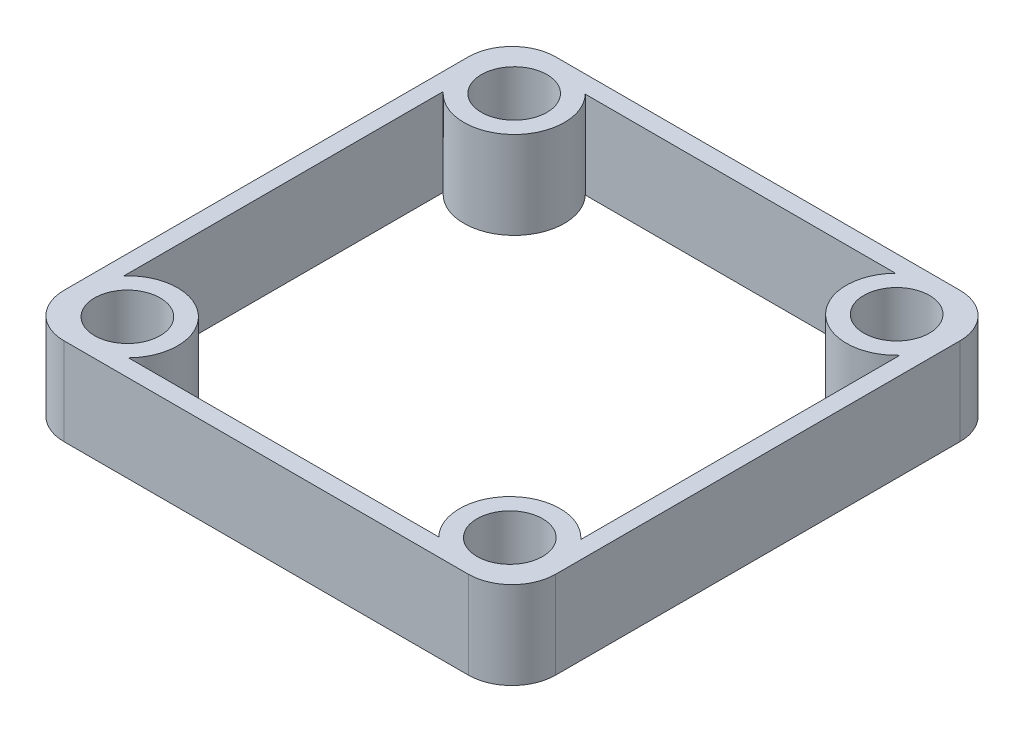
ISO-10303-21;
HEADER;
FILE_DESCRIPTION(('STEP AP214'),'2;1');
FILE_NAME('part.step','',(''),(''),'','','');
FILE_SCHEMA(('AUTOMOTIVE_DESIGN { 1 0 10303 214 1 1 1 1 }'));
ENDSEC;
DATA;
#1=APPLICATION_CONTEXT('core data for automotive mechanical design processes');
#2=APPLICATION_PROTOCOL_DEFINITION('international standard','automotive_design',2000,#1);
#3=PRODUCT_CONTEXT('',#1,'mechanical');
#4=PRODUCT('Part','Part','',(#3));
#5=PRODUCT_RELATED_PRODUCT_CATEGORY('part','',(#4));
#6=PRODUCT_DEFINITION_FORMATION('','',#4);
#7=PRODUCT_DEFINITION_CONTEXT('part definition',#1,'design');
#8=PRODUCT_DEFINITION('design','',#6,#7);
#9=PRODUCT_DEFINITION_SHAPE('','',#8);
#10=(LENGTH_UNIT() NAMED_UNIT(*) SI_UNIT(.MILLI.,.METRE.));
#11=(NAMED_UNIT(*) PLANE_ANGLE_UNIT() SI_UNIT($,.RADIAN.));
#12=(NAMED_UNIT(*) SI_UNIT($,.STERADIAN.) SOLID_ANGLE_UNIT());
#13=UNCERTAINTY_MEASURE_WITH_UNIT(LENGTH_MEASURE(1.E-05),#10,'distance_accuracy_value','');
#14=(GEOMETRIC_REPRESENTATION_CONTEXT(3) GLOBAL_UNCERTAINTY_ASSIGNED_CONTEXT((#13)) GLOBAL_UNIT_ASSIGNED_CONTEXT((#10,
#11,#12)) REPRESENTATION_CONTEXT('',''));
#15=CARTESIAN_POINT('',(0.,0.,0.));
#16=DIRECTION('',(0.,0.,1.));
#17=DIRECTION('',(1.,0.,0.));
#18=AXIS2_PLACEMENT_3D('',#15,#16,#17);
#19=CARTESIAN_POINT('',(9.25,4.,-9.25));
#20=DIRECTION('',(0.,-1.,0.));
#21=DIRECTION('',(0.,0.,-1.));
#22=AXIS2_PLACEMENT_3D('',#19,#20,#21);
#23=PLANE('',#22);
#24=CARTESIAN_POINT('',(-8.74999999999999,4.,8.85000000000002));
#25=DIRECTION('',(0.,1.,0.));
#26=DIRECTION('',(0.,0.,1.));
#27=AXIS2_PLACEMENT_3D('',#24,#25,#26);
#28=CIRCLE('',#27,1.5);
#29=CARTESIAN_POINT('',(-8.74999999999999,4.,10.35));
#30=VERTEX_POINT('',#29);
#31=EDGE_CURVE('E219',#30,#30,#28,.T.);
#32=ORIENTED_EDGE('',*,*,#31,.F.);
#33=EDGE_LOOP('',(#32));
#34=FACE_BOUND('',#33,.T.);
#35=CARTESIAN_POINT('',(-8.74999999999999,4.,-8.84999999999998));
#36=DIRECTION('',(0.,1.,0.));
#37=DIRECTION('',(0.,0.,-1.));
#38=AXIS2_PLACEMENT_3D('',#35,#36,#37);
#39=CIRCLE('',#38,1.5);
#40=CARTESIAN_POINT('',(-8.74999999999999,4.,-10.35));
#41=VERTEX_POINT('',#40);
#42=EDGE_CURVE('E225',#41,#41,#39,.T.);
#43=ORIENTED_EDGE('',*,*,#42,.F.);
#44=EDGE_LOOP('',(#43));
#45=FACE_BOUND('',#44,.T.);
#46=CARTESIAN_POINT('',(8.75000000000004,4.,8.85000000000001));
#47=DIRECTION('',(0.,1.,0.));
#48=DIRECTION('',(0.,0.,-1.));
#49=AXIS2_PLACEMENT_3D('',#46,#47,#48);
#50=CIRCLE('',#49,1.5);
#51=CARTESIAN_POINT('',(8.75000000000004,4.,7.35000000000001));
#52=VERTEX_POINT('',#51);
#53=EDGE_CURVE('E231',#52,#52,#50,.T.);
#54=ORIENTED_EDGE('',*,*,#53,.F.);
#55=EDGE_LOOP('',(#54));
#56=FACE_BOUND('',#55,.T.);
#57=CARTESIAN_POINT('',(8.75,4.,-8.85));
#58=DIRECTION('',(0.,1.,0.));
#59=DIRECTION('',(0.,0.,1.));
#60=AXIS2_PLACEMENT_3D('',#57,#58,#59);
#61=CIRCLE('',#60,1.5);
#62=CARTESIAN_POINT('',(8.75,4.,-7.35));
#63=VERTEX_POINT('',#62);
#64=EDGE_CURVE('E237',#63,#63,#61,.T.);
#65=ORIENTED_EDGE('',*,*,#64,.F.);
#66=EDGE_LOOP('',(#65));
#67=FACE_BOUND('',#66,.T.);
#68=CARTESIAN_POINT('',(9.25,4.,-9.25));
#69=DIRECTION('',(0.,1.,0.));
#70=DIRECTION('',(0.,0.,-1.));
#71=AXIS2_PLACEMENT_3D('',#68,#69,#70);
#72=CIRCLE('',#71,2.);
#73=CARTESIAN_POINT('',(11.25,4.,-9.24999999999998));
#74=VERTEX_POINT('',#73);
#75=CARTESIAN_POINT('',(9.24999999999998,4.,-11.25));
#76=VERTEX_POINT('',#75);
#77=EDGE_CURVE('E243',#74,#76,#72,.T.);
#78=ORIENTED_EDGE('',*,*,#77,.T.);
#79=DIRECTION('',(-1.,0.,0.));
#80=VECTOR('',#79,1.);
#81=CARTESIAN_POINT('',(-9.24999999999999,4.,-11.25));
#82=LINE('',#81,#80);
#83=CARTESIAN_POINT('',(-9.24999999999999,4.,-11.25));
#84=VERTEX_POINT('',#83);
#85=EDGE_CURVE('E246',#76,#84,#82,.T.);
#86=ORIENTED_EDGE('',*,*,#85,.T.);
#87=CARTESIAN_POINT('',(-9.25,4.,-9.25));
#88=DIRECTION('',(0.,1.,0.));
#89=DIRECTION('',(0.,0.,1.));
#90=AXIS2_PLACEMENT_3D('',#87,#88,#89);
#91=CIRCLE('',#90,2.);
#92=CARTESIAN_POINT('',(-11.25,4.,-9.24999999999998));
#93=VERTEX_POINT('',#92);
#94=EDGE_CURVE('E249',#84,#93,#91,.T.);
#95=ORIENTED_EDGE('',*,*,#94,.T.);
#96=DIRECTION('',(0.,0.,1.));
#97=VECTOR('',#96,1.);
#98=CARTESIAN_POINT('',(-11.25,4.,-9.24999999999998));
#99=LINE('',#98,#97);
#100=CARTESIAN_POINT('',(-11.25,4.,9.24999999999999));
#101=VERTEX_POINT('',#100);
#102=EDGE_CURVE('E251',#93,#101,#99,.T.);
#103=ORIENTED_EDGE('',*,*,#102,.T.);
#104=CARTESIAN_POINT('',(-9.25,4.,9.25));
#105=DIRECTION('',(0.,1.,0.));
#106=DIRECTION('',(0.,0.,1.));
#107=AXIS2_PLACEMENT_3D('',#104,#105,#106);
#108=CIRCLE('',#107,2.);
#109=CARTESIAN_POINT('',(-9.25,4.,11.25));
#110=VERTEX_POINT('',#109);
#111=EDGE_CURVE('E253',#101,#110,#108,.T.);
#112=ORIENTED_EDGE('',*,*,#111,.T.);
#113=DIRECTION('',(1.,0.,0.));
#114=VECTOR('',#113,1.);
#115=CARTESIAN_POINT('',(-9.24999999999998,4.,11.25));
#116=LINE('',#115,#114);
#117=CARTESIAN_POINT('',(9.24999999999999,4.,11.25));
#118=VERTEX_POINT('',#117);
#119=EDGE_CURVE('E255',#110,#118,#116,.T.);
#120=ORIENTED_EDGE('',*,*,#119,.T.);
#121=CARTESIAN_POINT('',(9.25,4.,9.25));
#122=DIRECTION('',(0.,1.,0.));
#123=DIRECTION('',(0.,0.,1.));
#124=AXIS2_PLACEMENT_3D('',#121,#122,#123);
#125=CIRCLE('',#124,2.);
#126=CARTESIAN_POINT('',(11.25,4.,9.24999999999999));
#127=VERTEX_POINT('',#126);
#128=EDGE_CURVE('E257',#118,#127,#125,.T.);
#129=ORIENTED_EDGE('',*,*,#128,.T.);
#130=DIRECTION('',(0.,0.,-1.));
#131=VECTOR('',#130,1.);
#132=CARTESIAN_POINT('',(11.25,4.,-9.24999999999998));
#133=LINE('',#132,#131);
#134=EDGE_CURVE('E259',#127,#74,#133,.T.);
#135=ORIENTED_EDGE('',*,*,#134,.T.);
#136=EDGE_LOOP('',(#78,#86,#95,#103,#112,#120,#129,#135));
#137=FACE_BOUND('',#136,.T.);
#138=CARTESIAN_POINT('',(8.75,4.,-8.85));
#139=DIRECTION('',(0.,-1.,0.));
#140=DIRECTION('',(0.,0.,1.));
#141=AXIS2_PLACEMENT_3D('',#138,#139,#140);
#142=CIRCLE('',#141,2.3);
#143=CARTESIAN_POINT('',(10.45,4.,-7.30080666151704));
#144=VERTEX_POINT('',#143);
#145=CARTESIAN_POINT('',(7.09772883581416,4.,-10.45));
#146=VERTEX_POINT('',#145);
#147=EDGE_CURVE('E154',#144,#146,#142,.T.);
#148=ORIENTED_EDGE('',*,*,#147,.F.);
#149=DIRECTION('',(0.,0.,-1.));
#150=VECTOR('',#149,1.);
#151=CARTESIAN_POINT('',(10.45,4.,-7.30080666151704));
#152=LINE('',#151,#150);
#153=CARTESIAN_POINT('',(10.45,4.,7.300806661517));
#154=VERTEX_POINT('',#153);
#155=EDGE_CURVE('E187',#154,#144,#152,.T.);
#156=ORIENTED_EDGE('',*,*,#155,.F.);
#157=CARTESIAN_POINT('',(8.75000000000004,4.,8.85000000000001));
#158=DIRECTION('',(0.,-1.,0.));
#159=DIRECTION('',(0.,0.,-1.));
#160=AXIS2_PLACEMENT_3D('',#157,#158,#159);
#161=CIRCLE('',#160,2.3);
#162=CARTESIAN_POINT('',(7.0977288358142,4.,10.45));
#163=VERTEX_POINT('',#162);
#164=EDGE_CURVE('E185',#163,#154,#161,.T.);
#165=ORIENTED_EDGE('',*,*,#164,.F.);
#166=DIRECTION('',(1.,0.,0.));
#167=VECTOR('',#166,1.);
#168=CARTESIAN_POINT('',(-7.09772883581414,4.,10.45));
#169=LINE('',#168,#167);
#170=CARTESIAN_POINT('',(-7.09772883581414,4.,10.45));
#171=VERTEX_POINT('',#170);
#172=EDGE_CURVE('E183',#171,#163,#169,.T.);
#173=ORIENTED_EDGE('',*,*,#172,.F.);
#174=CARTESIAN_POINT('',(-8.74999999999999,4.,8.85000000000002));
#175=DIRECTION('',(0.,-1.,0.));
#176=DIRECTION('',(0.,0.,1.));
#177=AXIS2_PLACEMENT_3D('',#174,#175,#176);
#178=CIRCLE('',#177,2.3);
#179=CARTESIAN_POINT('',(-10.45,4.,7.30080666151706));
#180=VERTEX_POINT('',#179);
#181=EDGE_CURVE('E181',#180,#171,#178,.T.);
#182=ORIENTED_EDGE('',*,*,#181,.F.);
#183=DIRECTION('',(0.,0.,1.));
#184=VECTOR('',#183,1.);
#185=CARTESIAN_POINT('',(-10.45,4.,-7.30080666151702));
#186=LINE('',#185,#184);
#187=CARTESIAN_POINT('',(-10.45,4.,-7.30080666151702));
#188=VERTEX_POINT('',#187);
#189=EDGE_CURVE('E177',#188,#180,#186,.T.);
#190=ORIENTED_EDGE('',*,*,#189,.F.);
#191=CARTESIAN_POINT('',(-8.74999999999999,4.,-8.84999999999998));
#192=DIRECTION('',(0.,-1.,0.));
#193=DIRECTION('',(0.,0.,-1.));
#194=AXIS2_PLACEMENT_3D('',#191,#192,#193);
#195=CIRCLE('',#194,2.3);
#196=CARTESIAN_POINT('',(-7.09772883581418,4.,-10.45));
#197=VERTEX_POINT('',#196);
#198=EDGE_CURVE('E175',#197,#188,#195,.T.);
#199=ORIENTED_EDGE('',*,*,#198,.F.);
#200=DIRECTION('',(-1.,0.,0.));
#201=VECTOR('',#200,1.);
#202=CARTESIAN_POINT('',(-7.09772883581418,4.,-10.45));
#203=LINE('',#202,#201);
#204=EDGE_CURVE('E162',#146,#197,#203,.T.);
#205=ORIENTED_EDGE('',*,*,#204,.F.);
#206=EDGE_LOOP('',(#148,#156,#165,#173,#182,#190,#199,#205));
#207=FACE_BOUND('',#206,.T.);
#208=ADVANCED_FACE('F41',(#34,#45,#56,#67,#137,#207),#23,.F.);
#209=CARTESIAN_POINT('',(9.25,0.,-9.25));
#210=DIRECTION('',(0.,-1.,0.));
#211=DIRECTION('',(0.,0.,-1.));
#212=AXIS2_PLACEMENT_3D('',#209,#210,#211);
#213=PLANE('',#212);
#214=CARTESIAN_POINT('',(-8.74999999999999,0.,-8.84999999999998));
#215=DIRECTION('',(0.,1.,0.));
#216=DIRECTION('',(0.,0.,-1.));
#217=AXIS2_PLACEMENT_3D('',#214,#215,#216);
#218=CIRCLE('',#217,1.5);
#219=CARTESIAN_POINT('',(-8.74999999999999,0.,-10.35));
#220=VERTEX_POINT('',#219);
#221=EDGE_CURVE('E222',#220,#220,#218,.T.);
#222=ORIENTED_EDGE('',*,*,#221,.T.);
#223=EDGE_LOOP('',(#222));
#224=FACE_BOUND('',#223,.T.);
#225=CARTESIAN_POINT('',(8.75,0.,-8.85));
#226=DIRECTION('',(0.,1.,0.));
#227=DIRECTION('',(0.,0.,1.));
#228=AXIS2_PLACEMENT_3D('',#225,#226,#227);
#229=CIRCLE('',#228,1.5);
#230=CARTESIAN_POINT('',(8.75,0.,-7.35));
#231=VERTEX_POINT('',#230);
#232=EDGE_CURVE('E234',#231,#231,#229,.T.);
#233=ORIENTED_EDGE('',*,*,#232,.T.);
#234=EDGE_LOOP('',(#233));
#235=FACE_BOUND('',#234,.T.);
#236=CARTESIAN_POINT('',(9.25,0.,-9.25));
#237=DIRECTION('',(0.,1.,0.));
#238=DIRECTION('',(0.,0.,-1.));
#239=AXIS2_PLACEMENT_3D('',#236,#237,#238);
#240=CIRCLE('',#239,2.);
#241=CARTESIAN_POINT('',(11.25,0.,-9.24999999999998));
#242=VERTEX_POINT('',#241);
#243=CARTESIAN_POINT('',(9.24999999999998,0.,-11.25));
#244=VERTEX_POINT('',#243);
#245=EDGE_CURVE('E240',#242,#244,#240,.T.);
#246=ORIENTED_EDGE('',*,*,#245,.F.);
#247=DIRECTION('',(0.,0.,-1.));
#248=VECTOR('',#247,1.);
#249=CARTESIAN_POINT('',(11.25,0.,-9.24999999999998));
#250=LINE('',#249,#248);
#251=CARTESIAN_POINT('',(11.25,0.,9.24999999999999));
#252=VERTEX_POINT('',#251);
#253=EDGE_CURVE('E247',#252,#242,#250,.T.);
#254=ORIENTED_EDGE('',*,*,#253,.F.);
#255=CARTESIAN_POINT('',(9.25,0.,9.25));
#256=DIRECTION('',(0.,1.,0.));
#257=DIRECTION('',(0.,0.,1.));
#258=AXIS2_PLACEMENT_3D('',#255,#256,#257);
#259=CIRCLE('',#258,2.);
#260=CARTESIAN_POINT('',(9.24999999999999,0.,11.25));
#261=VERTEX_POINT('',#260);
#262=EDGE_CURVE('E274',#261,#252,#259,.T.);
#263=ORIENTED_EDGE('',*,*,#262,.F.);
#264=DIRECTION('',(1.,0.,0.));
#265=VECTOR('',#264,1.);
#266=CARTESIAN_POINT('',(-9.24999999999998,0.,11.25));
#267=LINE('',#266,#265);
#268=CARTESIAN_POINT('',(-9.25,0.,11.25));
#269=VERTEX_POINT('',#268);
#270=EDGE_CURVE('E272',#269,#261,#267,.T.);
#271=ORIENTED_EDGE('',*,*,#270,.F.);
#272=CARTESIAN_POINT('',(-9.25,0.,9.25));
#273=DIRECTION('',(0.,1.,0.));
#274=DIRECTION('',(0.,0.,1.));
#275=AXIS2_PLACEMENT_3D('',#272,#273,#274);
#276=CIRCLE('',#275,2.);
#277=CARTESIAN_POINT('',(-11.25,0.,9.24999999999999));
#278=VERTEX_POINT('',#277);
#279=EDGE_CURVE('E270',#278,#269,#276,.T.);
#280=ORIENTED_EDGE('',*,*,#279,.F.);
#281=DIRECTION('',(0.,0.,1.));
#282=VECTOR('',#281,1.);
#283=CARTESIAN_POINT('',(-11.25,0.,-9.24999999999998));
#284=LINE('',#283,#282);
#285=CARTESIAN_POINT('',(-11.25,0.,-9.24999999999998));
#286=VERTEX_POINT('',#285);
#287=EDGE_CURVE('E268',#286,#278,#284,.T.);
#288=ORIENTED_EDGE('',*,*,#287,.F.);
#289=CARTESIAN_POINT('',(-9.25,0.,-9.25));
#290=DIRECTION('',(0.,1.,0.));
#291=DIRECTION('',(0.,0.,1.));
#292=AXIS2_PLACEMENT_3D('',#289,#290,#291);
#293=CIRCLE('',#292,2.);
#294=CARTESIAN_POINT('',(-9.24999999999999,0.,-11.25));
#295=VERTEX_POINT('',#294);
#296=EDGE_CURVE('E266',#295,#286,#293,.T.);
#297=ORIENTED_EDGE('',*,*,#296,.F.);
#298=DIRECTION('',(-1.,0.,0.));
#299=VECTOR('',#298,1.);
#300=CARTESIAN_POINT('',(-9.24999999999999,0.,-11.25));
#301=LINE('',#300,#299);
#302=EDGE_CURVE('E264',#244,#295,#301,.T.);
#303=ORIENTED_EDGE('',*,*,#302,.F.);
#304=EDGE_LOOP('',(#246,#254,#263,#271,#280,#288,#297,#303));
#305=FACE_BOUND('',#304,.T.);
#306=CARTESIAN_POINT('',(8.75000000000004,0.,8.85000000000001));
#307=DIRECTION('',(0.,1.,0.));
#308=DIRECTION('',(0.,0.,-1.));
#309=AXIS2_PLACEMENT_3D('',#306,#307,#308);
#310=CIRCLE('',#309,1.5);
#311=CARTESIAN_POINT('',(8.75000000000004,0.,7.35000000000001));
#312=VERTEX_POINT('',#311);
#313=EDGE_CURVE('E228',#312,#312,#310,.T.);
#314=ORIENTED_EDGE('',*,*,#313,.T.);
#315=EDGE_LOOP('',(#314));
#316=FACE_BOUND('',#315,.T.);
#317=CARTESIAN_POINT('',(-8.74999999999999,0.,8.85000000000002));
#318=DIRECTION('',(0.,1.,0.));
#319=DIRECTION('',(0.,0.,1.));
#320=AXIS2_PLACEMENT_3D('',#317,#318,#319);
#321=CIRCLE('',#320,1.5);
#322=CARTESIAN_POINT('',(-8.74999999999999,0.,10.35));
#323=VERTEX_POINT('',#322);
#324=EDGE_CURVE('E170',#323,#323,#321,.T.);
#325=ORIENTED_EDGE('',*,*,#324,.T.);
#326=EDGE_LOOP('',(#325));
#327=FACE_BOUND('',#326,.T.);
#328=DIRECTION('',(0.,0.,-1.));
#329=VECTOR('',#328,1.);
#330=CARTESIAN_POINT('',(10.45,0.,-7.30080666151704));
#331=LINE('',#330,#329);
#332=CARTESIAN_POINT('',(10.45,0.,7.300806661517));
#333=VERTEX_POINT('',#332);
#334=CARTESIAN_POINT('',(10.45,0.,-7.30080666151704));
#335=VERTEX_POINT('',#334);
#336=EDGE_CURVE('E163',#333,#335,#331,.T.);
#337=ORIENTED_EDGE('',*,*,#336,.T.);
#338=CARTESIAN_POINT('',(8.75,0.,-8.85));
#339=DIRECTION('',(0.,-1.,0.));
#340=DIRECTION('',(0.,0.,1.));
#341=AXIS2_PLACEMENT_3D('',#338,#339,#340);
#342=CIRCLE('',#341,2.3);
#343=CARTESIAN_POINT('',(7.09772883581416,0.,-10.45));
#344=VERTEX_POINT('',#343);
#345=EDGE_CURVE('E64',#335,#344,#342,.T.);
#346=ORIENTED_EDGE('',*,*,#345,.T.);
#347=DIRECTION('',(-1.,0.,0.));
#348=VECTOR('',#347,1.);
#349=CARTESIAN_POINT('',(-7.09772883581418,0.,-10.45));
#350=LINE('',#349,#348);
#351=CARTESIAN_POINT('',(-7.09772883581418,0.,-10.45));
#352=VERTEX_POINT('',#351);
#353=EDGE_CURVE('E169',#344,#352,#350,.T.);
#354=ORIENTED_EDGE('',*,*,#353,.T.);
#355=CARTESIAN_POINT('',(-8.74999999999999,0.,-8.84999999999998));
#356=DIRECTION('',(0.,-1.,0.));
#357=DIRECTION('',(0.,0.,-1.));
#358=AXIS2_PLACEMENT_3D('',#355,#356,#357);
#359=CIRCLE('',#358,2.3);
#360=CARTESIAN_POINT('',(-10.45,0.,-7.30080666151702));
#361=VERTEX_POINT('',#360);
#362=EDGE_CURVE('E191',#352,#361,#359,.T.);
#363=ORIENTED_EDGE('',*,*,#362,.T.);
#364=DIRECTION('',(0.,0.,1.));
#365=VECTOR('',#364,1.);
#366=CARTESIAN_POINT('',(-10.45,0.,-7.30080666151702));
#367=LINE('',#366,#365);
#368=CARTESIAN_POINT('',(-10.45,0.,7.30080666151706));
#369=VERTEX_POINT('',#368);
#370=EDGE_CURVE('E194',#361,#369,#367,.T.);
#371=ORIENTED_EDGE('',*,*,#370,.T.);
#372=CARTESIAN_POINT('',(-8.74999999999999,0.,8.85000000000002));
#373=DIRECTION('',(0.,-1.,0.));
#374=DIRECTION('',(0.,0.,1.));
#375=AXIS2_PLACEMENT_3D('',#372,#373,#374);
#376=CIRCLE('',#375,2.3);
#377=CARTESIAN_POINT('',(-7.09772883581414,0.,10.45));
#378=VERTEX_POINT('',#377);
#379=EDGE_CURVE('E197',#369,#378,#376,.T.);
#380=ORIENTED_EDGE('',*,*,#379,.T.);
#381=DIRECTION('',(1.,0.,0.));
#382=VECTOR('',#381,1.);
#383=CARTESIAN_POINT('',(-7.09772883581414,0.,10.45));
#384=LINE('',#383,#382);
#385=CARTESIAN_POINT('',(7.0977288358142,0.,10.45));
#386=VERTEX_POINT('',#385);
#387=EDGE_CURVE('E200',#378,#386,#384,.T.);
#388=ORIENTED_EDGE('',*,*,#387,.T.);
#389=CARTESIAN_POINT('',(8.75000000000004,0.,8.85000000000001));
#390=DIRECTION('',(0.,-1.,0.));
#391=DIRECTION('',(0.,0.,-1.));
#392=AXIS2_PLACEMENT_3D('',#389,#390,#391);
#393=CIRCLE('',#392,2.3);
#394=EDGE_CURVE('E203',#386,#333,#393,.T.);
#395=ORIENTED_EDGE('',*,*,#394,.T.);
#396=EDGE_LOOP('',(#337,#346,#354,#363,#371,#380,#388,#395));
#397=FACE_BOUND('',#396,.T.);
#398=ADVANCED_FACE('F304',(#224,#235,#305,#316,#327,#397),#213,.T.);
#399=CARTESIAN_POINT('',(9.25,4.,-9.25));
#400=DIRECTION('',(0.,-1.,0.));
#401=DIRECTION('',(0.,0.,-1.));
#402=AXIS2_PLACEMENT_3D('',#399,#400,#401);
#403=CYLINDRICAL_SURFACE('',#402,2.);
#404=ORIENTED_EDGE('',*,*,#245,.T.);
#405=DIRECTION('',(0.,-1.,0.));
#406=VECTOR('',#405,1.);
#407=CARTESIAN_POINT('',(9.24999999999998,4.,-11.25));
#408=LINE('',#407,#406);
#409=EDGE_CURVE('E11',#76,#244,#408,.T.);
#410=ORIENTED_EDGE('',*,*,#409,.F.);
#411=ORIENTED_EDGE('',*,*,#77,.F.);
#412=DIRECTION('',(0.,-1.,0.));
#413=VECTOR('',#412,1.);
#414=CARTESIAN_POINT('',(11.25,4.,-9.24999999999998));
#415=LINE('',#414,#413);
#416=EDGE_CURVE('E261',#74,#242,#415,.T.);
#417=ORIENTED_EDGE('',*,*,#416,.T.);
#418=EDGE_LOOP('',(#404,#410,#411,#417));
#419=FACE_BOUND('',#418,.T.);
#420=ADVANCED_FACE('F43',(#419),#403,.T.);
#421=CARTESIAN_POINT('',(-9.24999999999999,4.,-11.25));
#422=DIRECTION('',(0.,0.,1.));
#423=DIRECTION('',(1.,0.,0.));
#424=AXIS2_PLACEMENT_3D('',#421,#422,#423);
#425=PLANE('',#424);
#426=ORIENTED_EDGE('',*,*,#302,.T.);
#427=DIRECTION('',(0.,-1.,0.));
#428=VECTOR('',#427,1.);
#429=CARTESIAN_POINT('',(-9.24999999999999,4.,-11.25));
#430=LINE('',#429,#428);
#431=EDGE_CURVE('E49',#84,#295,#430,.T.);
#432=ORIENTED_EDGE('',*,*,#431,.F.);
#433=ORIENTED_EDGE('',*,*,#85,.F.);
#434=ORIENTED_EDGE('',*,*,#409,.T.);
#435=EDGE_LOOP('',(#426,#432,#433,#434));
#436=FACE_BOUND('',#435,.T.);
#437=ADVANCED_FACE('F321',(#436),#425,.F.);
#438=CARTESIAN_POINT('',(-9.25,4.,-9.25));
#439=DIRECTION('',(0.,-1.,0.));
#440=DIRECTION('',(0.,0.,-1.));
#441=AXIS2_PLACEMENT_3D('',#438,#439,#440);
#442=CYLINDRICAL_SURFACE('',#441,2.);
#443=ORIENTED_EDGE('',*,*,#296,.T.);
#444=DIRECTION('',(0.,-1.,0.));
#445=VECTOR('',#444,1.);
#446=CARTESIAN_POINT('',(-11.25,4.,-9.24999999999998));
#447=LINE('',#446,#445);
#448=EDGE_CURVE('E291',#93,#286,#447,.T.);
#449=ORIENTED_EDGE('',*,*,#448,.F.);
#450=ORIENTED_EDGE('',*,*,#94,.F.);
#451=ORIENTED_EDGE('',*,*,#431,.T.);
#452=EDGE_LOOP('',(#443,#449,#450,#451));
#453=FACE_BOUND('',#452,.T.);
#454=ADVANCED_FACE('F298',(#453),#442,.T.);
#455=CARTESIAN_POINT('',(-11.25,4.,-9.24999999999998));
#456=DIRECTION('',(1.,0.,0.));
#457=DIRECTION('',(0.,0.,-1.));
#458=AXIS2_PLACEMENT_3D('',#455,#456,#457);
#459=PLANE('',#458);
#460=ORIENTED_EDGE('',*,*,#287,.T.);
#461=DIRECTION('',(0.,-1.,0.));
#462=VECTOR('',#461,1.);
#463=CARTESIAN_POINT('',(-11.25,4.,9.24999999999999));
#464=LINE('',#463,#462);
#465=EDGE_CURVE('E288',#101,#278,#464,.T.);
#466=ORIENTED_EDGE('',*,*,#465,.F.);
#467=ORIENTED_EDGE('',*,*,#102,.F.);
#468=ORIENTED_EDGE('',*,*,#448,.T.);
#469=EDGE_LOOP('',(#460,#466,#467,#468));
#470=FACE_BOUND('',#469,.T.);
#471=ADVANCED_FACE('F310',(#470),#459,.F.);
#472=CARTESIAN_POINT('',(-9.25,4.,9.25));
#473=DIRECTION('',(0.,-1.,0.));
#474=DIRECTION('',(0.,0.,-1.));
#475=AXIS2_PLACEMENT_3D('',#472,#473,#474);
#476=CYLINDRICAL_SURFACE('',#475,2.);
#477=ORIENTED_EDGE('',*,*,#279,.T.);
#478=DIRECTION('',(0.,-1.,0.));
#479=VECTOR('',#478,1.);
#480=CARTESIAN_POINT('',(-9.25,4.,11.25));
#481=LINE('',#480,#479);
#482=EDGE_CURVE('E285',#110,#269,#481,.T.);
#483=ORIENTED_EDGE('',*,*,#482,.F.);
#484=ORIENTED_EDGE('',*,*,#111,.F.);
#485=ORIENTED_EDGE('',*,*,#465,.T.);
#486=EDGE_LOOP('',(#477,#483,#484,#485));
#487=FACE_BOUND('',#486,.T.);
#488=ADVANCED_FACE('F314',(#487),#476,.T.);
#489=CARTESIAN_POINT('',(-9.24999999999998,4.,11.25));
#490=DIRECTION('',(0.,0.,-1.));
#491=DIRECTION('',(-1.,0.,0.));
#492=AXIS2_PLACEMENT_3D('',#489,#490,#491);
#493=PLANE('',#492);
#494=ORIENTED_EDGE('',*,*,#270,.T.);
#495=DIRECTION('',(0.,-1.,0.));
#496=VECTOR('',#495,1.);
#497=CARTESIAN_POINT('',(9.24999999999999,4.,11.25));
#498=LINE('',#497,#496);
#499=EDGE_CURVE('E282',#118,#261,#498,.T.);
#500=ORIENTED_EDGE('',*,*,#499,.F.);
#501=ORIENTED_EDGE('',*,*,#119,.F.);
#502=ORIENTED_EDGE('',*,*,#482,.T.);
#503=EDGE_LOOP('',(#494,#500,#501,#502));
#504=FACE_BOUND('',#503,.T.);
#505=ADVANCED_FACE('F334',(#504),#493,.F.);
#506=CARTESIAN_POINT('',(9.25,4.,9.25));
#507=DIRECTION('',(0.,-1.,0.));
#508=DIRECTION('',(0.,0.,-1.));
#509=AXIS2_PLACEMENT_3D('',#506,#507,#508);
#510=CYLINDRICAL_SURFACE('',#509,2.);
#511=ORIENTED_EDGE('',*,*,#262,.T.);
#512=DIRECTION('',(0.,-1.,0.));
#513=VECTOR('',#512,1.);
#514=CARTESIAN_POINT('',(11.25,4.,9.24999999999999));
#515=LINE('',#514,#513);
#516=EDGE_CURVE('E279',#127,#252,#515,.T.);
#517=ORIENTED_EDGE('',*,*,#516,.F.);
#518=ORIENTED_EDGE('',*,*,#128,.F.);
#519=ORIENTED_EDGE('',*,*,#499,.T.);
#520=EDGE_LOOP('',(#511,#517,#518,#519));
#521=FACE_BOUND('',#520,.T.);
#522=ADVANCED_FACE('F332',(#521),#510,.T.);
#523=CARTESIAN_POINT('',(11.25,4.,-9.24999999999998));
#524=DIRECTION('',(-1.,0.,0.));
#525=DIRECTION('',(0.,0.,1.));
#526=AXIS2_PLACEMENT_3D('',#523,#524,#525);
#527=PLANE('',#526);
#528=ORIENTED_EDGE('',*,*,#253,.T.);
#529=ORIENTED_EDGE('',*,*,#416,.F.);
#530=ORIENTED_EDGE('',*,*,#134,.F.);
#531=ORIENTED_EDGE('',*,*,#516,.T.);
#532=EDGE_LOOP('',(#528,#529,#530,#531));
#533=FACE_BOUND('',#532,.T.);
#534=ADVANCED_FACE('F327',(#533),#527,.F.);
#535=CARTESIAN_POINT('',(8.75,4.,-8.85));
#536=DIRECTION('',(0.,-1.,0.));
#537=DIRECTION('',(0.,0.,-1.));
#538=AXIS2_PLACEMENT_3D('',#535,#536,#537);
#539=CYLINDRICAL_SURFACE('',#538,1.5);
#540=ORIENTED_EDGE('',*,*,#64,.T.);
#541=EDGE_LOOP('',(#540));
#542=FACE_BOUND('',#541,.T.);
#543=ORIENTED_EDGE('',*,*,#232,.F.);
#544=EDGE_LOOP('',(#543));
#545=FACE_BOUND('',#544,.T.);
#546=ADVANCED_FACE('F354',(#542,#545),#539,.F.);
#547=CARTESIAN_POINT('',(8.75000000000004,4.,8.85000000000001));
#548=DIRECTION('',(0.,-1.,0.));
#549=DIRECTION('',(0.,0.,-1.));
#550=AXIS2_PLACEMENT_3D('',#547,#548,#549);
#551=CYLINDRICAL_SURFACE('',#550,1.5);
#552=ORIENTED_EDGE('',*,*,#53,.T.);
#553=EDGE_LOOP('',(#552));
#554=FACE_BOUND('',#553,.T.);
#555=ORIENTED_EDGE('',*,*,#313,.F.);
#556=EDGE_LOOP('',(#555));
#557=FACE_BOUND('',#556,.T.);
#558=ADVANCED_FACE('F361',(#554,#557),#551,.F.);
#559=CARTESIAN_POINT('',(-8.74999999999999,4.,-8.84999999999998));
#560=DIRECTION('',(0.,-1.,0.));
#561=DIRECTION('',(0.,0.,-1.));
#562=AXIS2_PLACEMENT_3D('',#559,#560,#561);
#563=CYLINDRICAL_SURFACE('',#562,1.5);
#564=ORIENTED_EDGE('',*,*,#42,.T.);
#565=EDGE_LOOP('',(#564));
#566=FACE_BOUND('',#565,.T.);
#567=ORIENTED_EDGE('',*,*,#221,.F.);
#568=EDGE_LOOP('',(#567));
#569=FACE_BOUND('',#568,.T.);
#570=ADVANCED_FACE('F366',(#566,#569),#563,.F.);
#571=CARTESIAN_POINT('',(-8.74999999999999,4.,8.85000000000002));
#572=DIRECTION('',(0.,-1.,0.));
#573=DIRECTION('',(0.,0.,-1.));
#574=AXIS2_PLACEMENT_3D('',#571,#572,#573);
#575=CYLINDRICAL_SURFACE('',#574,1.5);
#576=ORIENTED_EDGE('',*,*,#31,.T.);
#577=EDGE_LOOP('',(#576));
#578=FACE_BOUND('',#577,.T.);
#579=ORIENTED_EDGE('',*,*,#324,.F.);
#580=EDGE_LOOP('',(#579));
#581=FACE_BOUND('',#580,.T.);
#582=ADVANCED_FACE('F376',(#578,#581),#575,.F.);
#583=CARTESIAN_POINT('',(8.75,4.,-8.85));
#584=DIRECTION('',(0.,-1.,0.));
#585=DIRECTION('',(0.,0.,-1.));
#586=AXIS2_PLACEMENT_3D('',#583,#584,#585);
#587=CYLINDRICAL_SURFACE('',#586,2.3);
#588=ORIENTED_EDGE('',*,*,#345,.F.);
#589=DIRECTION('',(0.,-1.,0.));
#590=VECTOR('',#589,1.);
#591=CARTESIAN_POINT('',(10.45,4.,-7.30080666151704));
#592=LINE('',#591,#590);
#593=EDGE_CURVE('E158',#144,#335,#592,.T.);
#594=ORIENTED_EDGE('',*,*,#593,.F.);
#595=ORIENTED_EDGE('',*,*,#147,.T.);
#596=DIRECTION('',(0.,-1.,0.));
#597=VECTOR('',#596,1.);
#598=CARTESIAN_POINT('',(7.09772883581416,4.,-10.45));
#599=LINE('',#598,#597);
#600=EDGE_CURVE('E157',#146,#344,#599,.T.);
#601=ORIENTED_EDGE('',*,*,#600,.T.);
#602=EDGE_LOOP('',(#588,#594,#595,#601));
#603=FACE_BOUND('',#602,.T.);
#604=ADVANCED_FACE('F156',(#603),#587,.T.);
#605=CARTESIAN_POINT('',(-7.09772883581418,4.,-10.45));
#606=DIRECTION('',(0.,0.,1.));
#607=DIRECTION('',(1.,0.,0.));
#608=AXIS2_PLACEMENT_3D('',#605,#606,#607);
#609=PLANE('',#608);
#610=ORIENTED_EDGE('',*,*,#353,.F.);
#611=ORIENTED_EDGE('',*,*,#600,.F.);
#612=ORIENTED_EDGE('',*,*,#204,.T.);
#613=DIRECTION('',(0.,-1.,0.));
#614=VECTOR('',#613,1.);
#615=CARTESIAN_POINT('',(-7.09772883581418,4.,-10.45));
#616=LINE('',#615,#614);
#617=EDGE_CURVE('E171',#197,#352,#616,.T.);
#618=ORIENTED_EDGE('',*,*,#617,.T.);
#619=EDGE_LOOP('',(#610,#611,#612,#618));
#620=FACE_BOUND('',#619,.T.);
#621=ADVANCED_FACE('F166',(#620),#609,.T.);
#622=CARTESIAN_POINT('',(-8.74999999999999,4.,-8.84999999999998));
#623=DIRECTION('',(0.,-1.,0.));
#624=DIRECTION('',(0.,0.,-1.));
#625=AXIS2_PLACEMENT_3D('',#622,#623,#624);
#626=CYLINDRICAL_SURFACE('',#625,2.3);
#627=ORIENTED_EDGE('',*,*,#362,.F.);
#628=ORIENTED_EDGE('',*,*,#617,.F.);
#629=ORIENTED_EDGE('',*,*,#198,.T.);
#630=DIRECTION('',(0.,-1.,0.));
#631=VECTOR('',#630,1.);
#632=CARTESIAN_POINT('',(-10.45,4.,-7.30080666151702));
#633=LINE('',#632,#631);
#634=EDGE_CURVE('E216',#188,#361,#633,.T.);
#635=ORIENTED_EDGE('',*,*,#634,.T.);
#636=EDGE_LOOP('',(#627,#628,#629,#635));
#637=FACE_BOUND('',#636,.T.);
#638=ADVANCED_FACE('F388',(#637),#626,.T.);
#639=CARTESIAN_POINT('',(-10.45,4.,-7.30080666151702));
#640=DIRECTION('',(1.,0.,0.));
#641=DIRECTION('',(0.,0.,-1.));
#642=AXIS2_PLACEMENT_3D('',#639,#640,#641);
#643=PLANE('',#642);
#644=ORIENTED_EDGE('',*,*,#370,.F.);
#645=ORIENTED_EDGE('',*,*,#634,.F.);
#646=ORIENTED_EDGE('',*,*,#189,.T.);
#647=DIRECTION('',(0.,-1.,0.));
#648=VECTOR('',#647,1.);
#649=CARTESIAN_POINT('',(-10.45,4.,7.30080666151706));
#650=LINE('',#649,#648);
#651=EDGE_CURVE('E214',#180,#369,#650,.T.);
#652=ORIENTED_EDGE('',*,*,#651,.T.);
#653=EDGE_LOOP('',(#644,#645,#646,#652));
#654=FACE_BOUND('',#653,.T.);
#655=ADVANCED_FACE('F391',(#654),#643,.T.);
#656=CARTESIAN_POINT('',(-8.74999999999999,4.,8.85000000000002));
#657=DIRECTION('',(0.,-1.,0.));
#658=DIRECTION('',(0.,0.,-1.));
#659=AXIS2_PLACEMENT_3D('',#656,#657,#658);
#660=CYLINDRICAL_SURFACE('',#659,2.3);
#661=ORIENTED_EDGE('',*,*,#379,.F.);
#662=ORIENTED_EDGE('',*,*,#651,.F.);
#663=ORIENTED_EDGE('',*,*,#181,.T.);
#664=DIRECTION('',(0.,-1.,0.));
#665=VECTOR('',#664,1.);
#666=CARTESIAN_POINT('',(-7.09772883581414,4.,10.45));
#667=LINE('',#666,#665);
#668=EDGE_CURVE('E212',#171,#378,#667,.T.);
#669=ORIENTED_EDGE('',*,*,#668,.T.);
#670=EDGE_LOOP('',(#661,#662,#663,#669));
#671=FACE_BOUND('',#670,.T.);
#672=ADVANCED_FACE('F395',(#671),#660,.T.);
#673=CARTESIAN_POINT('',(-7.09772883581414,4.,10.45));
#674=DIRECTION('',(0.,0.,-1.));
#675=DIRECTION('',(-1.,0.,0.));
#676=AXIS2_PLACEMENT_3D('',#673,#674,#675);
#677=PLANE('',#676);
#678=ORIENTED_EDGE('',*,*,#387,.F.);
#679=ORIENTED_EDGE('',*,*,#668,.F.);
#680=ORIENTED_EDGE('',*,*,#172,.T.);
#681=DIRECTION('',(0.,-1.,0.));
#682=VECTOR('',#681,1.);
#683=CARTESIAN_POINT('',(7.0977288358142,4.,10.45));
#684=LINE('',#683,#682);
#685=EDGE_CURVE('E210',#163,#386,#684,.T.);
#686=ORIENTED_EDGE('',*,*,#685,.T.);
#687=EDGE_LOOP('',(#678,#679,#680,#686));
#688=FACE_BOUND('',#687,.T.);
#689=ADVANCED_FACE('F399',(#688),#677,.T.);
#690=CARTESIAN_POINT('',(8.75000000000004,4.,8.85000000000001));
#691=DIRECTION('',(0.,-1.,0.));
#692=DIRECTION('',(0.,0.,-1.));
#693=AXIS2_PLACEMENT_3D('',#690,#691,#692);
#694=CYLINDRICAL_SURFACE('',#693,2.3);
#695=ORIENTED_EDGE('',*,*,#394,.F.);
#696=ORIENTED_EDGE('',*,*,#685,.F.);
#697=ORIENTED_EDGE('',*,*,#164,.T.);
#698=DIRECTION('',(0.,-1.,0.));
#699=VECTOR('',#698,1.);
#700=CARTESIAN_POINT('',(10.45,4.,7.300806661517));
#701=LINE('',#700,#699);
#702=EDGE_CURVE('E56',#154,#333,#701,.T.);
#703=ORIENTED_EDGE('',*,*,#702,.T.);
#704=EDGE_LOOP('',(#695,#696,#697,#703));
#705=FACE_BOUND('',#704,.T.);
#706=ADVANCED_FACE('F403',(#705),#694,.T.);
#707=CARTESIAN_POINT('',(10.45,4.,-7.30080666151704));
#708=DIRECTION('',(-1.,0.,0.));
#709=DIRECTION('',(0.,0.,1.));
#710=AXIS2_PLACEMENT_3D('',#707,#708,#709);
#711=PLANE('',#710);
#712=ORIENTED_EDGE('',*,*,#336,.F.);
#713=ORIENTED_EDGE('',*,*,#702,.F.);
#714=ORIENTED_EDGE('',*,*,#155,.T.);
#715=ORIENTED_EDGE('',*,*,#593,.T.);
#716=EDGE_LOOP('',(#712,#713,#714,#715));
#717=FACE_BOUND('',#716,.T.);
#718=ADVANCED_FACE('F407',(#717),#711,.T.);
#719=CLOSED_SHELL('',(#208,#398,#420,#437,#454,#471,#488,#505,#522,#534,#546,#558,#570,#582,
#604,#621,#638,#655,#672,#689,#706,#718));
#720=MANIFOLD_SOLID_BREP('B2',#719);
#721=ADVANCED_BREP_SHAPE_REPRESENTATION('',(#18,#720),#14);
#722=SHAPE_DEFINITION_REPRESENTATION(#9,#721);
ENDSEC;
END-ISO-10303-21;
